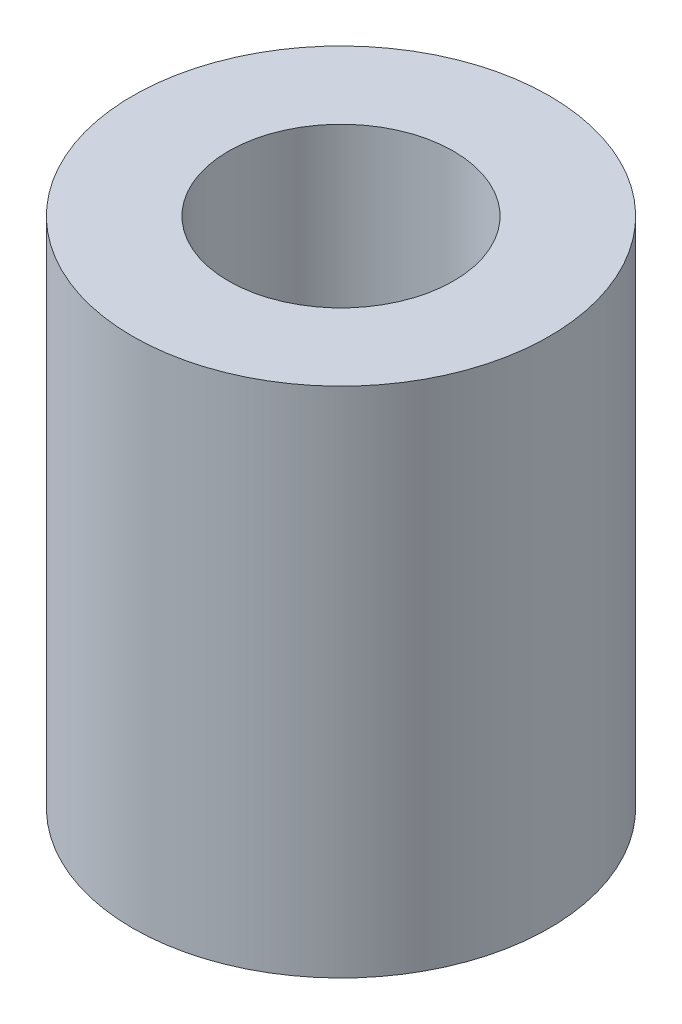
ISO-10303-21;
HEADER;
FILE_DESCRIPTION(('STEP AP214'),'2;1');
FILE_NAME('part.step','',(''),(''),'','','');
FILE_SCHEMA(('AUTOMOTIVE_DESIGN { 1 0 10303 214 1 1 1 1 }'));
ENDSEC;
DATA;
#1=APPLICATION_CONTEXT('core data for automotive mechanical design processes');
#2=APPLICATION_PROTOCOL_DEFINITION('international standard','automotive_design',2000,#1);
#3=PRODUCT_CONTEXT('',#1,'mechanical');
#4=PRODUCT('Part','Part','',(#3));
#5=PRODUCT_RELATED_PRODUCT_CATEGORY('part','',(#4));
#6=PRODUCT_DEFINITION_FORMATION('','',#4);
#7=PRODUCT_DEFINITION_CONTEXT('part definition',#1,'design');
#8=PRODUCT_DEFINITION('design','',#6,#7);
#9=PRODUCT_DEFINITION_SHAPE('','',#8);
#10=(LENGTH_UNIT() NAMED_UNIT(*) SI_UNIT(.MILLI.,.METRE.));
#11=(NAMED_UNIT(*) PLANE_ANGLE_UNIT() SI_UNIT($,.RADIAN.));
#12=(NAMED_UNIT(*) SI_UNIT($,.STERADIAN.) SOLID_ANGLE_UNIT());
#13=UNCERTAINTY_MEASURE_WITH_UNIT(LENGTH_MEASURE(1.E-05),#10,'distance_accuracy_value','');
#14=(GEOMETRIC_REPRESENTATION_CONTEXT(3) GLOBAL_UNCERTAINTY_ASSIGNED_CONTEXT((#13)) GLOBAL_UNIT_ASSIGNED_CONTEXT((#10,
#11,#12)) REPRESENTATION_CONTEXT('',''));
#15=CARTESIAN_POINT('',(0.,0.,0.));
#16=DIRECTION('',(0.,0.,1.));
#17=DIRECTION('',(1.,0.,0.));
#18=AXIS2_PLACEMENT_3D('',#15,#16,#17);
#19=CARTESIAN_POINT('',(0.,15.621,0.));
#20=DIRECTION('',(0.,1.,0.));
#21=DIRECTION('',(0.,0.,1.));
#22=AXIS2_PLACEMENT_3D('',#19,#20,#21);
#23=PLANE('',#22);
#24=CARTESIAN_POINT('',(0.,15.621,0.));
#25=DIRECTION('',(0.,1.,0.));
#26=DIRECTION('',(0.,0.,1.));
#27=AXIS2_PLACEMENT_3D('',#24,#25,#26);
#28=CIRCLE('',#27,6.35);
#29=CARTESIAN_POINT('',(0.,15.621,-6.35));
#30=VERTEX_POINT('',#29);
#31=EDGE_CURVE('E10',#30,#30,#28,.T.);
#32=ORIENTED_EDGE('',*,*,#31,.T.);
#33=EDGE_LOOP('',(#32));
#34=FACE_BOUND('',#33,.T.);
#35=CARTESIAN_POINT('',(0.,15.621,0.));
#36=DIRECTION('',(0.,1.,0.));
#37=DIRECTION('',(0.,0.,1.));
#38=AXIS2_PLACEMENT_3D('',#35,#36,#37);
#39=CIRCLE('',#38,3.429);
#40=CARTESIAN_POINT('',(0.,15.621,-3.429));
#41=VERTEX_POINT('',#40);
#42=EDGE_CURVE('E54',#41,#41,#39,.T.);
#43=ORIENTED_EDGE('',*,*,#42,.F.);
#44=EDGE_LOOP('',(#43));
#45=FACE_BOUND('',#44,.T.);
#46=ADVANCED_FACE('F41',(#34,#45),#23,.T.);
#47=CARTESIAN_POINT('',(0.,0.,0.));
#48=DIRECTION('',(0.,1.,0.));
#49=DIRECTION('',(0.,0.,1.));
#50=AXIS2_PLACEMENT_3D('',#47,#48,#49);
#51=PLANE('',#50);
#52=CARTESIAN_POINT('',(0.,0.,0.));
#53=DIRECTION('',(0.,1.,0.));
#54=DIRECTION('',(0.,0.,1.));
#55=AXIS2_PLACEMENT_3D('',#52,#53,#54);
#56=CIRCLE('',#55,6.35);
#57=CARTESIAN_POINT('',(0.,0.,-6.35));
#58=VERTEX_POINT('',#57);
#59=EDGE_CURVE('E45',#58,#58,#56,.T.);
#60=ORIENTED_EDGE('',*,*,#59,.F.);
#61=EDGE_LOOP('',(#60));
#62=FACE_BOUND('',#61,.T.);
#63=CARTESIAN_POINT('',(0.,0.,0.));
#64=DIRECTION('',(0.,1.,0.));
#65=DIRECTION('',(0.,0.,1.));
#66=AXIS2_PLACEMENT_3D('',#63,#64,#65);
#67=CIRCLE('',#66,3.429);
#68=CARTESIAN_POINT('',(0.,0.,-3.429));
#69=VERTEX_POINT('',#68);
#70=EDGE_CURVE('E56',#69,#69,#67,.T.);
#71=ORIENTED_EDGE('',*,*,#70,.T.);
#72=EDGE_LOOP('',(#71));
#73=FACE_BOUND('',#72,.T.);
#74=ADVANCED_FACE('F68',(#62,#73),#51,.F.);
#75=CARTESIAN_POINT('',(0.,15.621,0.));
#76=DIRECTION('',(0.,-1.,0.));
#77=DIRECTION('',(0.,0.,-1.));
#78=AXIS2_PLACEMENT_3D('',#75,#76,#77);
#79=CYLINDRICAL_SURFACE('',#78,6.35);
#80=CARTESIAN_POINT('',(0.,15.621,-6.35));
#81=CARTESIAN_POINT('',(0.,15.45828125,-6.35));
#82=CARTESIAN_POINT('',(0.,15.2955625,-6.35));
#83=CARTESIAN_POINT('',(0.,14.970125,-6.35));
#84=CARTESIAN_POINT('',(0.,14.80740625,-6.35));
#85=CARTESIAN_POINT('',(0.,14.48196875,-6.35));
#86=CARTESIAN_POINT('',(0.,14.31925,-6.35));
#87=CARTESIAN_POINT('',(0.,13.9938125,-6.35));
#88=CARTESIAN_POINT('',(0.,13.83109375,-6.35));
#89=CARTESIAN_POINT('',(0.,13.50565625,-6.35));
#90=CARTESIAN_POINT('',(0.,13.3429375,-6.35));
#91=CARTESIAN_POINT('',(0.,13.0175,-6.35));
#92=CARTESIAN_POINT('',(0.,12.85478125,-6.35));
#93=CARTESIAN_POINT('',(0.,12.52934375,-6.35));
#94=CARTESIAN_POINT('',(0.,12.366625,-6.35));
#95=CARTESIAN_POINT('',(0.,12.0411875,-6.35));
#96=CARTESIAN_POINT('',(0.,11.87846875,-6.35));
#97=CARTESIAN_POINT('',(0.,11.55303125,-6.35));
#98=CARTESIAN_POINT('',(0.,11.3903125,-6.35));
#99=CARTESIAN_POINT('',(0.,11.064875,-6.35));
#100=CARTESIAN_POINT('',(0.,10.90215625,-6.35));
#101=CARTESIAN_POINT('',(0.,10.57671875,-6.35));
#102=CARTESIAN_POINT('',(0.,10.414,-6.35));
#103=CARTESIAN_POINT('',(0.,10.0885625,-6.35));
#104=CARTESIAN_POINT('',(0.,9.92584375,-6.35));
#105=CARTESIAN_POINT('',(0.,9.60040625,-6.35));
#106=CARTESIAN_POINT('',(0.,9.4376875,-6.35));
#107=CARTESIAN_POINT('',(0.,9.11225,-6.35));
#108=CARTESIAN_POINT('',(0.,8.94953125,-6.35));
#109=CARTESIAN_POINT('',(0.,8.62409375,-6.35));
#110=CARTESIAN_POINT('',(0.,8.461375,-6.35));
#111=CARTESIAN_POINT('',(0.,8.1359375,-6.35));
#112=CARTESIAN_POINT('',(0.,7.97321875,-6.35));
#113=CARTESIAN_POINT('',(0.,7.64778125,-6.35));
#114=CARTESIAN_POINT('',(0.,7.4850625,-6.35));
#115=CARTESIAN_POINT('',(0.,7.159625,-6.35));
#116=CARTESIAN_POINT('',(0.,6.99690625,-6.35));
#117=CARTESIAN_POINT('',(0.,6.67146875,-6.35));
#118=CARTESIAN_POINT('',(0.,6.50875,-6.35));
#119=CARTESIAN_POINT('',(0.,6.1833125,-6.35));
#120=CARTESIAN_POINT('',(0.,6.02059375,-6.35));
#121=CARTESIAN_POINT('',(0.,5.69515625,-6.35));
#122=CARTESIAN_POINT('',(0.,5.5324375,-6.35));
#123=CARTESIAN_POINT('',(0.,5.207,-6.35));
#124=CARTESIAN_POINT('',(0.,5.04428125,-6.35));
#125=CARTESIAN_POINT('',(0.,4.71884375,-6.35));
#126=CARTESIAN_POINT('',(0.,4.556125,-6.35));
#127=CARTESIAN_POINT('',(0.,4.2306875,-6.35));
#128=CARTESIAN_POINT('',(0.,4.06796875,-6.35));
#129=CARTESIAN_POINT('',(0.,3.74253125,-6.35));
#130=CARTESIAN_POINT('',(0.,3.5798125,-6.35));
#131=CARTESIAN_POINT('',(0.,3.254375,-6.35));
#132=CARTESIAN_POINT('',(0.,3.09165625,-6.35));
#133=CARTESIAN_POINT('',(0.,2.76621875,-6.35));
#134=CARTESIAN_POINT('',(0.,2.6035,-6.35));
#135=CARTESIAN_POINT('',(0.,2.2780625,-6.35));
#136=CARTESIAN_POINT('',(0.,2.11534375,-6.35));
#137=CARTESIAN_POINT('',(0.,1.78990625,-6.35));
#138=CARTESIAN_POINT('',(0.,1.6271875,-6.35));
#139=CARTESIAN_POINT('',(0.,1.30175,-6.35));
#140=CARTESIAN_POINT('',(0.,1.13903125,-6.35));
#141=CARTESIAN_POINT('',(0.,0.813593749999998,-6.35));
#142=CARTESIAN_POINT('',(0.,0.650874999999998,-6.35));
#143=CARTESIAN_POINT('',(0.,0.325437499999998,-6.35));
#144=CARTESIAN_POINT('',(0.,0.162718749999998,-6.35));
#145=CARTESIAN_POINT('',(0.,0.,-6.35));
#146=B_SPLINE_CURVE_WITH_KNOTS('',3,(#80,#81,#82,#83,#84,#85,#86,#87,#88,#89,#90,#91,#92,#93,
#94,#95,#96,#97,#98,#99,#100,#101,#102,#103,#104,#105,#106,#107,#108,#109,#110,#111,#112,#113,
#114,#115,#116,#117,#118,#119,#120,#121,#122,#123,#124,#125,#126,#127,#128,#129,#130,#131,#132,
#133,#134,#135,#136,#137,#138,#139,#140,#141,#142,#143,#144,#145),.UNSPECIFIED.,.F.,.F.,(4,2,2,
2,2,2,2,2,2,2,2,2,2,2,2,2,2,2,2,2,2,2,2,2,2,2,2,2,2,2,2,2,4),(0.,0.48815625,0.9763125,
1.46446875,1.952625,2.44078125,2.9289375,3.41709375,3.90525,4.39340625,4.8815625,5.36971875,
5.857875,6.34603125,6.8341875,7.32234375,7.8105,8.29865625,8.7868125,9.27496875,9.763125,
10.25128125,10.7394375,11.22759375,11.71575,12.20390625,12.6920625,13.18021875,13.668375,
14.15653125,14.6446875,15.13284375,15.621),.UNSPECIFIED.);
#147=EDGE_CURVE('BSEAM43',#30,#58,#146,.T.);
#148=ORIENTED_EDGE('',*,*,#31,.F.);
#149=ORIENTED_EDGE('',*,*,#59,.T.);
#150=ORIENTED_EDGE('',*,*,#147,.T.);
#151=ORIENTED_EDGE('',*,*,#147,.F.);
#152=EDGE_LOOP('',(#148,#150,#149,#151));
#153=FACE_BOUND('',#152,.T.);
#154=ADVANCED_FACE('F43',(#153),#79,.T.);
#155=CARTESIAN_POINT('',(0.,15.621,0.));
#156=DIRECTION('',(0.,-1.,0.));
#157=DIRECTION('',(0.,0.,-1.));
#158=AXIS2_PLACEMENT_3D('',#155,#156,#157);
#159=CYLINDRICAL_SURFACE('',#158,3.429);
#160=CARTESIAN_POINT('',(0.,15.621,-3.429));
#161=CARTESIAN_POINT('',(0.,15.45828125,-3.429));
#162=CARTESIAN_POINT('',(0.,15.2955625,-3.429));
#163=CARTESIAN_POINT('',(0.,14.970125,-3.429));
#164=CARTESIAN_POINT('',(0.,14.80740625,-3.429));
#165=CARTESIAN_POINT('',(0.,14.48196875,-3.429));
#166=CARTESIAN_POINT('',(0.,14.31925,-3.429));
#167=CARTESIAN_POINT('',(0.,13.9938125,-3.429));
#168=CARTESIAN_POINT('',(0.,13.83109375,-3.429));
#169=CARTESIAN_POINT('',(0.,13.50565625,-3.429));
#170=CARTESIAN_POINT('',(0.,13.3429375,-3.429));
#171=CARTESIAN_POINT('',(0.,13.0175,-3.429));
#172=CARTESIAN_POINT('',(0.,12.85478125,-3.429));
#173=CARTESIAN_POINT('',(0.,12.52934375,-3.429));
#174=CARTESIAN_POINT('',(0.,12.366625,-3.429));
#175=CARTESIAN_POINT('',(0.,12.0411875,-3.429));
#176=CARTESIAN_POINT('',(0.,11.87846875,-3.429));
#177=CARTESIAN_POINT('',(0.,11.55303125,-3.429));
#178=CARTESIAN_POINT('',(0.,11.3903125,-3.429));
#179=CARTESIAN_POINT('',(0.,11.064875,-3.429));
#180=CARTESIAN_POINT('',(0.,10.90215625,-3.429));
#181=CARTESIAN_POINT('',(0.,10.57671875,-3.429));
#182=CARTESIAN_POINT('',(0.,10.414,-3.429));
#183=CARTESIAN_POINT('',(0.,10.0885625,-3.429));
#184=CARTESIAN_POINT('',(0.,9.92584375,-3.429));
#185=CARTESIAN_POINT('',(0.,9.60040625,-3.429));
#186=CARTESIAN_POINT('',(0.,9.4376875,-3.429));
#187=CARTESIAN_POINT('',(0.,9.11225,-3.429));
#188=CARTESIAN_POINT('',(0.,8.94953125,-3.429));
#189=CARTESIAN_POINT('',(0.,8.62409375,-3.429));
#190=CARTESIAN_POINT('',(0.,8.461375,-3.429));
#191=CARTESIAN_POINT('',(0.,8.1359375,-3.429));
#192=CARTESIAN_POINT('',(0.,7.97321875,-3.429));
#193=CARTESIAN_POINT('',(0.,7.64778125,-3.429));
#194=CARTESIAN_POINT('',(0.,7.4850625,-3.429));
#195=CARTESIAN_POINT('',(0.,7.159625,-3.429));
#196=CARTESIAN_POINT('',(0.,6.99690625,-3.429));
#197=CARTESIAN_POINT('',(0.,6.67146875,-3.429));
#198=CARTESIAN_POINT('',(0.,6.50875,-3.429));
#199=CARTESIAN_POINT('',(0.,6.1833125,-3.429));
#200=CARTESIAN_POINT('',(0.,6.02059375,-3.429));
#201=CARTESIAN_POINT('',(0.,5.69515625,-3.429));
#202=CARTESIAN_POINT('',(0.,5.5324375,-3.429));
#203=CARTESIAN_POINT('',(0.,5.207,-3.429));
#204=CARTESIAN_POINT('',(0.,5.04428125,-3.429));
#205=CARTESIAN_POINT('',(0.,4.71884375,-3.429));
#206=CARTESIAN_POINT('',(0.,4.556125,-3.429));
#207=CARTESIAN_POINT('',(0.,4.2306875,-3.429));
#208=CARTESIAN_POINT('',(0.,4.06796875,-3.429));
#209=CARTESIAN_POINT('',(0.,3.74253125,-3.429));
#210=CARTESIAN_POINT('',(0.,3.5798125,-3.429));
#211=CARTESIAN_POINT('',(0.,3.254375,-3.429));
#212=CARTESIAN_POINT('',(0.,3.09165625,-3.429));
#213=CARTESIAN_POINT('',(0.,2.76621875,-3.429));
#214=CARTESIAN_POINT('',(0.,2.6035,-3.429));
#215=CARTESIAN_POINT('',(0.,2.2780625,-3.429));
#216=CARTESIAN_POINT('',(0.,2.11534375,-3.429));
#217=CARTESIAN_POINT('',(0.,1.78990625,-3.429));
#218=CARTESIAN_POINT('',(0.,1.6271875,-3.429));
#219=CARTESIAN_POINT('',(0.,1.30175,-3.429));
#220=CARTESIAN_POINT('',(0.,1.13903125,-3.429));
#221=CARTESIAN_POINT('',(0.,0.813593749999998,-3.429));
#222=CARTESIAN_POINT('',(0.,0.650874999999998,-3.429));
#223=CARTESIAN_POINT('',(0.,0.325437499999998,-3.429));
#224=CARTESIAN_POINT('',(0.,0.162718749999998,-3.429));
#225=CARTESIAN_POINT('',(0.,0.,-3.429));
#226=B_SPLINE_CURVE_WITH_KNOTS('',3,(#160,#161,#162,#163,#164,#165,#166,#167,#168,#169,#170,
#171,#172,#173,#174,#175,#176,#177,#178,#179,#180,#181,#182,#183,#184,#185,#186,#187,#188,#189,
#190,#191,#192,#193,#194,#195,#196,#197,#198,#199,#200,#201,#202,#203,#204,#205,#206,#207,#208,
#209,#210,#211,#212,#213,#214,#215,#216,#217,#218,#219,#220,#221,#222,#223,#224,#225),
.UNSPECIFIED.,.F.,.F.,(4,2,2,2,2,2,2,2,2,2,2,2,2,2,2,2,2,2,2,2,2,2,2,2,2,2,2,2,2,2,2,2,4),(0.,
0.48815625,0.9763125,1.46446875,1.952625,2.44078125,2.9289375,3.41709375,3.90525,4.39340625,
4.8815625,5.36971875,5.857875,6.34603125,6.8341875,7.32234375,7.8105,8.29865625,8.7868125,
9.27496875,9.763125,10.25128125,10.7394375,11.22759375,11.71575,12.20390625,12.6920625,
13.18021875,13.668375,14.15653125,14.6446875,15.13284375,15.621),.UNSPECIFIED.);
#227=EDGE_CURVE('BSEAM64',#41,#69,#226,.T.);
#228=ORIENTED_EDGE('',*,*,#42,.T.);
#229=ORIENTED_EDGE('',*,*,#70,.F.);
#230=ORIENTED_EDGE('',*,*,#227,.T.);
#231=ORIENTED_EDGE('',*,*,#227,.F.);
#232=EDGE_LOOP('',(#228,#230,#229,#231));
#233=FACE_BOUND('',#232,.T.);
#234=ADVANCED_FACE('F64',(#233),#159,.F.);
#235=CLOSED_SHELL('',(#46,#74,#154,#234));
#236=MANIFOLD_SOLID_BREP('B2',#235);
#237=ADVANCED_BREP_SHAPE_REPRESENTATION('',(#18,#236),#14);
#238=SHAPE_DEFINITION_REPRESENTATION(#9,#237);
ENDSEC;
END-ISO-10303-21;
